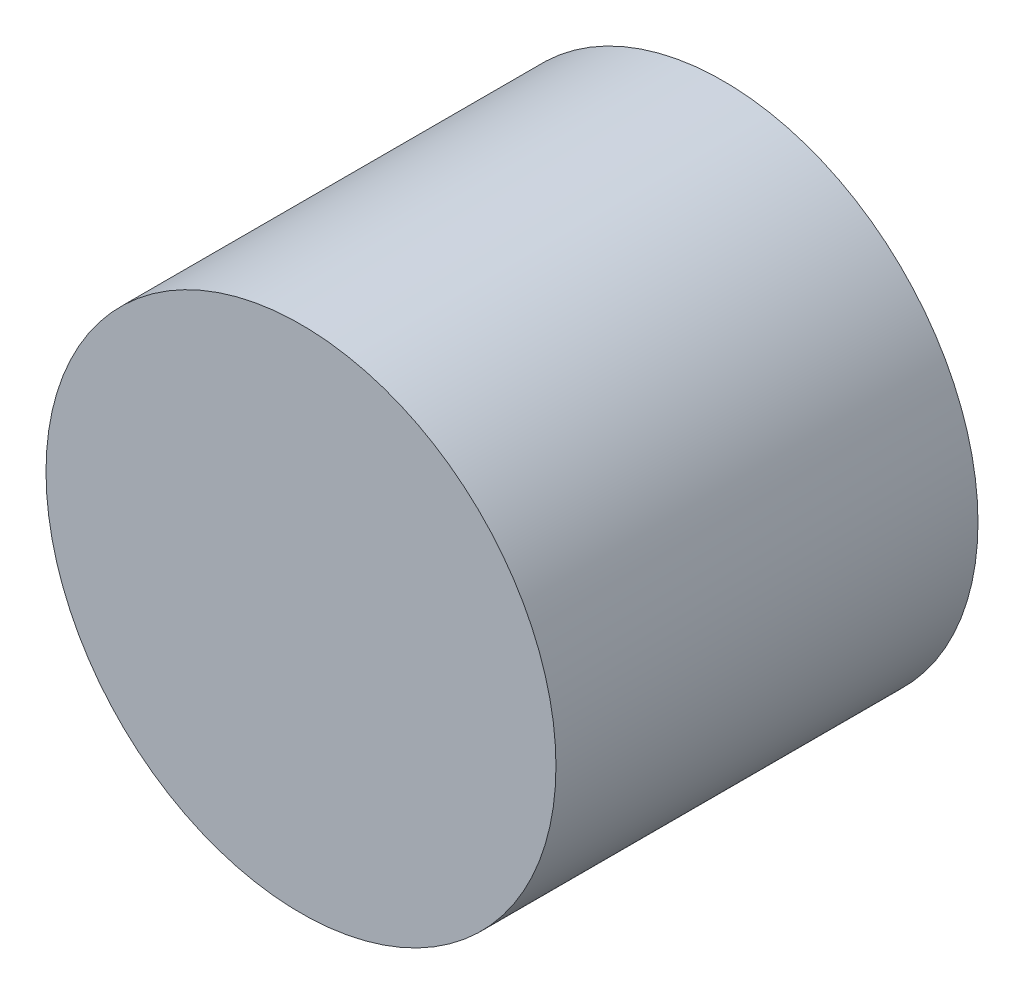
ISO-10303-21;
HEADER;
FILE_DESCRIPTION(('STEP AP214'),'2;1');
FILE_NAME('part.step','',(''),(''),'','','');
FILE_SCHEMA(('AUTOMOTIVE_DESIGN { 1 0 10303 214 1 1 1 1 }'));
ENDSEC;
DATA;
#1=APPLICATION_CONTEXT('core data for automotive mechanical design processes');
#2=APPLICATION_PROTOCOL_DEFINITION('international standard','automotive_design',2000,#1);
#3=PRODUCT_CONTEXT('',#1,'mechanical');
#4=PRODUCT('Part','Part','',(#3));
#5=PRODUCT_RELATED_PRODUCT_CATEGORY('part','',(#4));
#6=PRODUCT_DEFINITION_FORMATION('','',#4);
#7=PRODUCT_DEFINITION_CONTEXT('part definition',#1,'design');
#8=PRODUCT_DEFINITION('design','',#6,#7);
#9=PRODUCT_DEFINITION_SHAPE('','',#8);
#10=(LENGTH_UNIT() NAMED_UNIT(*) SI_UNIT(.MILLI.,.METRE.));
#11=(NAMED_UNIT(*) PLANE_ANGLE_UNIT() SI_UNIT($,.RADIAN.));
#12=(NAMED_UNIT(*) SI_UNIT($,.STERADIAN.) SOLID_ANGLE_UNIT());
#13=UNCERTAINTY_MEASURE_WITH_UNIT(LENGTH_MEASURE(1.E-05),#10,'distance_accuracy_value','');
#14=(GEOMETRIC_REPRESENTATION_CONTEXT(3) GLOBAL_UNCERTAINTY_ASSIGNED_CONTEXT((#13)) GLOBAL_UNIT_ASSIGNED_CONTEXT((#10,
#11,#12)) REPRESENTATION_CONTEXT('',''));
#15=CARTESIAN_POINT('',(0.,0.,0.));
#16=DIRECTION('',(0.,0.,1.));
#17=DIRECTION('',(1.,0.,0.));
#18=AXIS2_PLACEMENT_3D('',#15,#16,#17);
#19=CARTESIAN_POINT('',(4.18923361109968,-21.3214521477792,65.0121933088198));
#20=DIRECTION('',(0.,0.,-1.));
#21=DIRECTION('',(-1.,0.,0.));
#22=AXIS2_PLACEMENT_3D('',#19,#20,#21);
#23=CYLINDRICAL_SURFACE('',#22,14.5);
#24=CARTESIAN_POINT('',(4.18923361109968,-21.3214521477792,0.));
#25=DIRECTION('',(0.,0.,1.));
#26=DIRECTION('',(1.,0.,0.));
#27=AXIS2_PLACEMENT_3D('',#24,#25,#26);
#28=CIRCLE('',#27,14.5);
#29=CARTESIAN_POINT('',(18.6892336110997,-21.3214521477792,0.));
#30=VERTEX_POINT('',#29);
#31=EDGE_CURVE('E45',#30,#30,#28,.T.);
#32=ORIENTED_EDGE('',*,*,#31,.T.);
#33=EDGE_LOOP('',(#32));
#34=FACE_BOUND('',#33,.T.);
#35=CARTESIAN_POINT('',(4.18923361109968,-21.3214521477792,24.0000000000001));
#36=DIRECTION('',(0.,0.,1.));
#37=DIRECTION('',(1.,0.,0.));
#38=AXIS2_PLACEMENT_3D('',#35,#36,#37);
#39=CIRCLE('',#38,14.5);
#40=CARTESIAN_POINT('',(18.6892336110997,-21.3214521477792,24.0000000000001));
#41=VERTEX_POINT('',#40);
#42=EDGE_CURVE('E37',#41,#41,#39,.T.);
#43=ORIENTED_EDGE('',*,*,#42,.F.);
#44=EDGE_LOOP('',(#43));
#45=FACE_BOUND('',#44,.T.);
#46=ADVANCED_FACE('F33',(#34,#45),#23,.T.);
#47=CARTESIAN_POINT('',(4.18923361109968,-21.3214521477792,0.));
#48=DIRECTION('',(0.,0.,1.));
#49=DIRECTION('',(1.,0.,0.));
#50=AXIS2_PLACEMENT_3D('',#47,#48,#49);
#51=PLANE('',#50);
#52=CARTESIAN_POINT('',(4.18923361109968,-21.3214521477792,0.));
#53=DIRECTION('',(0.,0.,-1.));
#54=DIRECTION('',(-1.,0.,0.));
#55=AXIS2_PLACEMENT_3D('',#52,#53,#54);
#56=CIRCLE('',#55,5.1);
#57=CARTESIAN_POINT('',(-0.910766388900322,-21.3214521477792,0.));
#58=VERTEX_POINT('',#57);
#59=EDGE_CURVE('E10',#58,#58,#56,.T.);
#60=ORIENTED_EDGE('',*,*,#59,.F.);
#61=EDGE_LOOP('',(#60));
#62=FACE_BOUND('',#61,.T.);
#63=ORIENTED_EDGE('',*,*,#31,.F.);
#64=EDGE_LOOP('',(#63));
#65=FACE_BOUND('',#64,.T.);
#66=ADVANCED_FACE('F64',(#62,#65),#51,.F.);
#67=CARTESIAN_POINT('',(1.10757735017236E-13,0.,24.0000000000001));
#68=DIRECTION('',(0.,0.,1.));
#69=DIRECTION('',(-1.,0.,0.));
#70=AXIS2_PLACEMENT_3D('',#67,#68,#69);
#71=PLANE('',#70);
#72=ORIENTED_EDGE('',*,*,#42,.T.);
#73=EDGE_LOOP('',(#72));
#74=FACE_BOUND('',#73,.T.);
#75=ADVANCED_FACE('F35',(#74),#71,.T.);
#76=CARTESIAN_POINT('',(4.18923361109968,-21.3214521477792,-2.));
#77=DIRECTION('',(0.,0.,1.));
#78=DIRECTION('',(1.,0.,0.));
#79=AXIS2_PLACEMENT_3D('',#76,#77,#78);
#80=CYLINDRICAL_SURFACE('',#79,5.1);
#81=CARTESIAN_POINT('',(4.18923361109968,-21.3214521477792,-2.));
#82=DIRECTION('',(0.,0.,-1.));
#83=DIRECTION('',(-1.,0.,0.));
#84=AXIS2_PLACEMENT_3D('',#81,#82,#83);
#85=CIRCLE('',#84,5.1);
#86=CARTESIAN_POINT('',(-0.910766388900322,-21.3214521477792,-2.));
#87=VERTEX_POINT('',#86);
#88=EDGE_CURVE('E47',#87,#87,#85,.T.);
#89=ORIENTED_EDGE('',*,*,#88,.F.);
#90=EDGE_LOOP('',(#89));
#91=FACE_BOUND('',#90,.T.);
#92=ORIENTED_EDGE('',*,*,#59,.T.);
#93=EDGE_LOOP('',(#92));
#94=FACE_BOUND('',#93,.T.);
#95=ADVANCED_FACE('F56',(#91,#94),#80,.T.);
#96=CARTESIAN_POINT('',(4.18923361109968,-21.3214521477792,-2.));
#97=DIRECTION('',(0.,0.,-1.));
#98=DIRECTION('',(-1.,0.,0.));
#99=AXIS2_PLACEMENT_3D('',#96,#97,#98);
#100=PLANE('',#99);
#101=ORIENTED_EDGE('',*,*,#88,.T.);
#102=EDGE_LOOP('',(#101));
#103=FACE_BOUND('',#102,.T.);
#104=ADVANCED_FACE('F54',(#103),#100,.T.);
#105=CLOSED_SHELL('',(#46,#66,#75,#95,#104));
#106=MANIFOLD_SOLID_BREP('B2',#105);
#107=ADVANCED_BREP_SHAPE_REPRESENTATION('',(#18,#106),#14);
#108=SHAPE_DEFINITION_REPRESENTATION(#9,#107);
ENDSEC;
END-ISO-10303-21;
